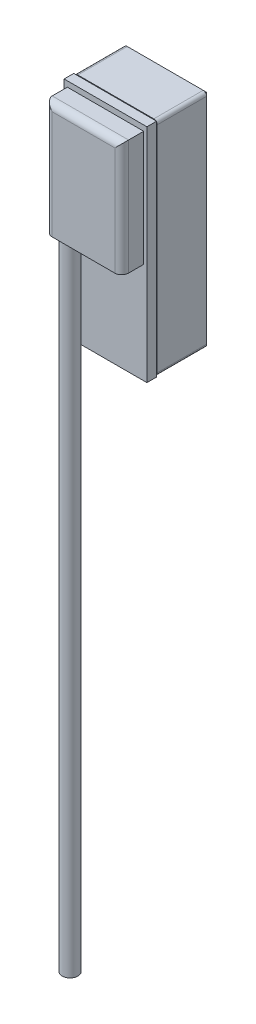
ISO-10303-21;
HEADER;
FILE_DESCRIPTION(('STEP AP214'),'2;1');
FILE_NAME('part.step','',(''),(''),'','','');
FILE_SCHEMA(('AUTOMOTIVE_DESIGN { 1 0 10303 214 1 1 1 1 }'));
ENDSEC;
DATA;
#1=APPLICATION_CONTEXT('core data for automotive mechanical design processes');
#2=APPLICATION_PROTOCOL_DEFINITION('international standard','automotive_design',2000,#1);
#3=PRODUCT_CONTEXT('',#1,'mechanical');
#4=PRODUCT('Part','Part','',(#3));
#5=PRODUCT_RELATED_PRODUCT_CATEGORY('part','',(#4));
#6=PRODUCT_DEFINITION_FORMATION('','',#4);
#7=PRODUCT_DEFINITION_CONTEXT('part definition',#1,'design');
#8=PRODUCT_DEFINITION('design','',#6,#7);
#9=PRODUCT_DEFINITION_SHAPE('','',#8);
#10=(LENGTH_UNIT() NAMED_UNIT(*) SI_UNIT(.MILLI.,.METRE.));
#11=(NAMED_UNIT(*) PLANE_ANGLE_UNIT() SI_UNIT($,.RADIAN.));
#12=(NAMED_UNIT(*) SI_UNIT($,.STERADIAN.) SOLID_ANGLE_UNIT());
#13=UNCERTAINTY_MEASURE_WITH_UNIT(LENGTH_MEASURE(1.E-05),#10,'distance_accuracy_value','');
#14=(GEOMETRIC_REPRESENTATION_CONTEXT(3) GLOBAL_UNCERTAINTY_ASSIGNED_CONTEXT((#13)) GLOBAL_UNIT_ASSIGNED_CONTEXT((#10,
#11,#12)) REPRESENTATION_CONTEXT('',''));
#15=CARTESIAN_POINT('',(0.,0.,0.));
#16=DIRECTION('',(0.,0.,1.));
#17=DIRECTION('',(1.,0.,0.));
#18=AXIS2_PLACEMENT_3D('',#15,#16,#17);
#19=CARTESIAN_POINT('',(0.,0.,4.59));
#20=DIRECTION('',(0.,0.,-1.));
#21=DIRECTION('',(-1.,0.,0.));
#22=AXIS2_PLACEMENT_3D('',#19,#20,#21);
#23=PLANE('',#22);
#24=DIRECTION('',(0.,1.,0.));
#25=VECTOR('',#24,1.);
#26=CARTESIAN_POINT('',(3.01,-8.055,4.59));
#27=LINE('',#26,#25);
#28=CARTESIAN_POINT('',(3.01,-8.055,4.59));
#29=VERTEX_POINT('',#28);
#30=CARTESIAN_POINT('',(3.01,8.055,4.59));
#31=VERTEX_POINT('',#30);
#32=EDGE_CURVE('E161',#29,#31,#27,.T.);
#33=ORIENTED_EDGE('',*,*,#32,.T.);
#34=DIRECTION('',(-1.,0.,0.));
#35=VECTOR('',#34,1.);
#36=CARTESIAN_POINT('',(-3.01,8.055,4.59));
#37=LINE('',#36,#35);
#38=CARTESIAN_POINT('',(-3.01,8.055,4.59));
#39=VERTEX_POINT('',#38);
#40=EDGE_CURVE('E164',#31,#39,#37,.T.);
#41=ORIENTED_EDGE('',*,*,#40,.T.);
#42=DIRECTION('',(0.,-1.,0.));
#43=VECTOR('',#42,1.);
#44=CARTESIAN_POINT('',(-3.01,-8.055,4.59));
#45=LINE('',#44,#43);
#46=CARTESIAN_POINT('',(-3.01,-8.055,4.59));
#47=VERTEX_POINT('',#46);
#48=EDGE_CURVE('E167',#39,#47,#45,.T.);
#49=ORIENTED_EDGE('',*,*,#48,.T.);
#50=DIRECTION('',(1.,0.,0.));
#51=VECTOR('',#50,1.);
#52=CARTESIAN_POINT('',(-3.01,-8.055,4.59));
#53=LINE('',#52,#51);
#54=EDGE_CURVE('E169',#47,#29,#53,.T.);
#55=ORIENTED_EDGE('',*,*,#54,.T.);
#56=EDGE_LOOP('',(#33,#41,#49,#55));
#57=FACE_BOUND('',#56,.T.);
#58=DIRECTION('',(0.,1.,0.));
#59=VECTOR('',#58,1.);
#60=CARTESIAN_POINT('',(2.775,-0.725000000000003,4.59));
#61=LINE('',#60,#59);
#62=CARTESIAN_POINT('',(2.775,-0.725000000000003,4.59));
#63=VERTEX_POINT('',#62);
#64=CARTESIAN_POINT('',(2.775,7.655,4.59));
#65=VERTEX_POINT('',#64);
#66=EDGE_CURVE('E128',#63,#65,#61,.T.);
#67=ORIENTED_EDGE('',*,*,#66,.F.);
#68=DIRECTION('',(1.,0.,0.));
#69=VECTOR('',#68,1.);
#70=CARTESIAN_POINT('',(-2.775,-0.725000000000003,4.59));
#71=LINE('',#70,#69);
#72=CARTESIAN_POINT('',(-2.775,-0.725000000000003,4.59));
#73=VERTEX_POINT('',#72);
#74=EDGE_CURVE('E140',#73,#63,#71,.T.);
#75=ORIENTED_EDGE('',*,*,#74,.F.);
#76=DIRECTION('',(0.,-1.,0.));
#77=VECTOR('',#76,1.);
#78=CARTESIAN_POINT('',(-2.775,-0.725000000000003,4.59));
#79=LINE('',#78,#77);
#80=CARTESIAN_POINT('',(-2.775,7.655,4.59));
#81=VERTEX_POINT('',#80);
#82=EDGE_CURVE('E148',#81,#73,#79,.T.);
#83=ORIENTED_EDGE('',*,*,#82,.F.);
#84=DIRECTION('',(-1.,0.,0.));
#85=VECTOR('',#84,1.);
#86=CARTESIAN_POINT('',(-2.775,7.655,4.59));
#87=LINE('',#86,#85);
#88=EDGE_CURVE('E143',#65,#81,#87,.T.);
#89=ORIENTED_EDGE('',*,*,#88,.F.);
#90=EDGE_LOOP('',(#67,#75,#83,#89));
#91=FACE_BOUND('',#90,.T.);
#92=ADVANCED_FACE('F47',(#57,#91),#23,.F.);
#93=CARTESIAN_POINT('',(3.01,-8.055,4.59));
#94=DIRECTION('',(-1.,0.,0.));
#95=DIRECTION('',(0.,0.,1.));
#96=AXIS2_PLACEMENT_3D('',#93,#94,#95);
#97=PLANE('',#96);
#98=DIRECTION('',(0.,1.,0.));
#99=VECTOR('',#98,1.);
#100=CARTESIAN_POINT('',(3.01,-8.055,3.89));
#101=LINE('',#100,#99);
#102=CARTESIAN_POINT('',(3.01,-8.055,3.89));
#103=VERTEX_POINT('',#102);
#104=CARTESIAN_POINT('',(3.01,8.055,3.89));
#105=VERTEX_POINT('',#104);
#106=EDGE_CURVE('E160',#103,#105,#101,.T.);
#107=ORIENTED_EDGE('',*,*,#106,.T.);
#108=DIRECTION('',(0.,0.,-1.));
#109=VECTOR('',#108,1.);
#110=CARTESIAN_POINT('',(3.01,8.055,4.59));
#111=LINE('',#110,#109);
#112=EDGE_CURVE('E187',#31,#105,#111,.T.);
#113=ORIENTED_EDGE('',*,*,#112,.F.);
#114=ORIENTED_EDGE('',*,*,#32,.F.);
#115=DIRECTION('',(0.,0.,-1.));
#116=VECTOR('',#115,1.);
#117=CARTESIAN_POINT('',(3.01,-8.055,4.59));
#118=LINE('',#117,#116);
#119=EDGE_CURVE('E171',#29,#103,#118,.T.);
#120=ORIENTED_EDGE('',*,*,#119,.T.);
#121=EDGE_LOOP('',(#107,#113,#114,#120));
#122=FACE_BOUND('',#121,.T.);
#123=ADVANCED_FACE('F235',(#122),#97,.F.);
#124=CARTESIAN_POINT('',(-3.01,8.055,4.59));
#125=DIRECTION('',(0.,-1.,0.));
#126=DIRECTION('',(0.,0.,-1.));
#127=AXIS2_PLACEMENT_3D('',#124,#125,#126);
#128=PLANE('',#127);
#129=DIRECTION('',(-1.,0.,0.));
#130=VECTOR('',#129,1.);
#131=CARTESIAN_POINT('',(-3.01,8.055,3.89));
#132=LINE('',#131,#130);
#133=CARTESIAN_POINT('',(-3.01,8.055,3.89));
#134=VERTEX_POINT('',#133);
#135=EDGE_CURVE('E174',#105,#134,#132,.T.);
#136=ORIENTED_EDGE('',*,*,#135,.T.);
#137=DIRECTION('',(0.,0.,-1.));
#138=VECTOR('',#137,1.);
#139=CARTESIAN_POINT('',(-3.01,8.055,4.59));
#140=LINE('',#139,#138);
#141=EDGE_CURVE('E184',#39,#134,#140,.T.);
#142=ORIENTED_EDGE('',*,*,#141,.F.);
#143=ORIENTED_EDGE('',*,*,#40,.F.);
#144=ORIENTED_EDGE('',*,*,#112,.T.);
#145=EDGE_LOOP('',(#136,#142,#143,#144));
#146=FACE_BOUND('',#145,.T.);
#147=ADVANCED_FACE('F241',(#146),#128,.F.);
#148=CARTESIAN_POINT('',(-3.01,-8.055,4.59));
#149=DIRECTION('',(1.,0.,0.));
#150=DIRECTION('',(0.,0.,-1.));
#151=AXIS2_PLACEMENT_3D('',#148,#149,#150);
#152=PLANE('',#151);
#153=DIRECTION('',(0.,-1.,0.));
#154=VECTOR('',#153,1.);
#155=CARTESIAN_POINT('',(-3.01,-8.055,3.89));
#156=LINE('',#155,#154);
#157=CARTESIAN_POINT('',(-3.01,-8.055,3.89));
#158=VERTEX_POINT('',#157);
#159=EDGE_CURVE('E176',#134,#158,#156,.T.);
#160=ORIENTED_EDGE('',*,*,#159,.T.);
#161=DIRECTION('',(0.,0.,-1.));
#162=VECTOR('',#161,1.);
#163=CARTESIAN_POINT('',(-3.01,-8.055,4.59));
#164=LINE('',#163,#162);
#165=EDGE_CURVE('E181',#47,#158,#164,.T.);
#166=ORIENTED_EDGE('',*,*,#165,.F.);
#167=ORIENTED_EDGE('',*,*,#48,.F.);
#168=ORIENTED_EDGE('',*,*,#141,.T.);
#169=EDGE_LOOP('',(#160,#166,#167,#168));
#170=FACE_BOUND('',#169,.T.);
#171=ADVANCED_FACE('F253',(#170),#152,.F.);
#172=CARTESIAN_POINT('',(-3.01,-8.055,4.59));
#173=DIRECTION('',(0.,1.,0.));
#174=DIRECTION('',(0.,0.,1.));
#175=AXIS2_PLACEMENT_3D('',#172,#173,#174);
#176=PLANE('',#175);
#177=DIRECTION('',(1.,0.,0.));
#178=VECTOR('',#177,1.);
#179=CARTESIAN_POINT('',(-3.01,-8.055,3.89));
#180=LINE('',#179,#178);
#181=EDGE_CURVE('E165',#158,#103,#180,.T.);
#182=ORIENTED_EDGE('',*,*,#181,.T.);
#183=ORIENTED_EDGE('',*,*,#119,.F.);
#184=ORIENTED_EDGE('',*,*,#54,.F.);
#185=ORIENTED_EDGE('',*,*,#165,.T.);
#186=EDGE_LOOP('',(#182,#183,#184,#185));
#187=FACE_BOUND('',#186,.T.);
#188=ADVANCED_FACE('F249',(#187),#176,.F.);
#189=CARTESIAN_POINT('',(0.,0.,3.89));
#190=DIRECTION('',(0.,0.,-1.));
#191=DIRECTION('',(-1.,0.,0.));
#192=AXIS2_PLACEMENT_3D('',#189,#190,#191);
#193=PLANE('',#192);
#194=ORIENTED_EDGE('',*,*,#106,.F.);
#195=ORIENTED_EDGE('',*,*,#181,.F.);
#196=ORIENTED_EDGE('',*,*,#159,.F.);
#197=ORIENTED_EDGE('',*,*,#135,.F.);
#198=EDGE_LOOP('',(#194,#195,#196,#197));
#199=FACE_BOUND('',#198,.T.);
#200=ADVANCED_FACE('F246',(#199),#193,.T.);
#201=CARTESIAN_POINT('',(2.775,-0.725000000000003,6.19));
#202=DIRECTION('',(-1.,0.,0.));
#203=DIRECTION('',(0.,0.,1.));
#204=AXIS2_PLACEMENT_3D('',#201,#202,#203);
#205=PLANE('',#204);
#206=DIRECTION('',(0.,0.,-1.));
#207=VECTOR('',#206,1.);
#208=CARTESIAN_POINT('',(2.775,7.655,6.19));
#209=LINE('',#208,#207);
#210=CARTESIAN_POINT('',(2.775,7.655,5.69));
#211=VERTEX_POINT('',#210);
#212=EDGE_CURVE('E158',#211,#65,#209,.T.);
#213=ORIENTED_EDGE('',*,*,#212,.F.);
#214=DIRECTION('',(0.,1.,0.));
#215=VECTOR('',#214,1.);
#216=CARTESIAN_POINT('',(2.775,-0.725000000000003,5.69));
#217=LINE('',#216,#215);
#218=CARTESIAN_POINT('',(2.775,-0.725000000000003,5.69));
#219=VERTEX_POINT('',#218);
#220=EDGE_CURVE('E12',#211,#219,#217,.F.);
#221=ORIENTED_EDGE('',*,*,#220,.T.);
#222=DIRECTION('',(0.,0.,-1.));
#223=VECTOR('',#222,1.);
#224=CARTESIAN_POINT('',(2.775,-0.725000000000003,6.19));
#225=LINE('',#224,#223);
#226=EDGE_CURVE('E125',#219,#63,#225,.T.);
#227=ORIENTED_EDGE('',*,*,#226,.T.);
#228=ORIENTED_EDGE('',*,*,#66,.T.);
#229=EDGE_LOOP('',(#213,#221,#227,#228));
#230=FACE_BOUND('',#229,.T.);
#231=ADVANCED_FACE('F127',(#230),#205,.F.);
#232=CARTESIAN_POINT('',(-2.775,7.655,6.19));
#233=DIRECTION('',(0.,-1.,0.));
#234=DIRECTION('',(0.,0.,-1.));
#235=AXIS2_PLACEMENT_3D('',#232,#233,#234);
#236=PLANE('',#235);
#237=DIRECTION('',(0.,0.,-1.));
#238=VECTOR('',#237,1.);
#239=CARTESIAN_POINT('',(-2.775,7.655,6.19));
#240=LINE('',#239,#238);
#241=CARTESIAN_POINT('',(-2.775,7.655,5.69));
#242=VERTEX_POINT('',#241);
#243=EDGE_CURVE('E156',#242,#81,#240,.T.);
#244=ORIENTED_EDGE('',*,*,#243,.F.);
#245=DIRECTION('',(-1.,0.,0.));
#246=VECTOR('',#245,1.);
#247=CARTESIAN_POINT('',(-2.775,7.655,5.69));
#248=LINE('',#247,#246);
#249=EDGE_CURVE('E56',#242,#211,#248,.F.);
#250=ORIENTED_EDGE('',*,*,#249,.T.);
#251=ORIENTED_EDGE('',*,*,#212,.T.);
#252=ORIENTED_EDGE('',*,*,#88,.T.);
#253=EDGE_LOOP('',(#244,#250,#251,#252));
#254=FACE_BOUND('',#253,.T.);
#255=ADVANCED_FACE('F218',(#254),#236,.F.);
#256=CARTESIAN_POINT('',(-2.775,-0.725000000000003,6.19));
#257=DIRECTION('',(1.,0.,0.));
#258=DIRECTION('',(0.,0.,-1.));
#259=AXIS2_PLACEMENT_3D('',#256,#257,#258);
#260=PLANE('',#259);
#261=DIRECTION('',(0.,0.,-1.));
#262=VECTOR('',#261,1.);
#263=CARTESIAN_POINT('',(-2.775,-0.725000000000003,6.19));
#264=LINE('',#263,#262);
#265=CARTESIAN_POINT('',(-2.775,-0.725000000000003,5.69));
#266=VERTEX_POINT('',#265);
#267=EDGE_CURVE('E133',#266,#73,#264,.T.);
#268=ORIENTED_EDGE('',*,*,#267,.F.);
#269=DIRECTION('',(0.,-1.,0.));
#270=VECTOR('',#269,1.);
#271=CARTESIAN_POINT('',(-2.775,-0.725000000000003,5.69));
#272=LINE('',#271,#270);
#273=EDGE_CURVE('E71',#266,#242,#272,.F.);
#274=ORIENTED_EDGE('',*,*,#273,.T.);
#275=ORIENTED_EDGE('',*,*,#243,.T.);
#276=ORIENTED_EDGE('',*,*,#82,.T.);
#277=EDGE_LOOP('',(#268,#274,#275,#276));
#278=FACE_BOUND('',#277,.T.);
#279=ADVANCED_FACE('F224',(#278),#260,.F.);
#280=CARTESIAN_POINT('',(-2.775,-0.725000000000003,6.19));
#281=DIRECTION('',(0.,1.,0.));
#282=DIRECTION('',(0.,0.,1.));
#283=AXIS2_PLACEMENT_3D('',#280,#281,#282);
#284=PLANE('',#283);
#285=CARTESIAN_POINT('',(-1.775,-0.725000000000003,5.39));
#286=DIRECTION('',(0.,1.,0.));
#287=DIRECTION('',(0.,0.,1.));
#288=AXIS2_PLACEMENT_3D('',#285,#286,#287);
#289=CIRCLE('',#288,0.57);
#290=CARTESIAN_POINT('',(-1.775,-0.725000000000003,5.96));
#291=VERTEX_POINT('',#290);
#292=EDGE_CURVE('E190',#291,#291,#289,.F.);
#293=ORIENTED_EDGE('',*,*,#292,.F.);
#294=EDGE_LOOP('',(#293));
#295=FACE_BOUND('',#294,.T.);
#296=DIRECTION('',(1.,0.,0.));
#297=VECTOR('',#296,1.);
#298=CARTESIAN_POINT('',(-2.775,-0.725000000000003,6.19));
#299=LINE('',#298,#297);
#300=CARTESIAN_POINT('',(-2.275,-0.725000000000003,6.19));
#301=VERTEX_POINT('',#300);
#302=CARTESIAN_POINT('',(2.275,-0.725000000000003,6.19));
#303=VERTEX_POINT('',#302);
#304=EDGE_CURVE('E134',#301,#303,#299,.T.);
#305=ORIENTED_EDGE('',*,*,#304,.F.);
#306=CARTESIAN_POINT('',(-2.275,-0.725000000000003,5.69));
#307=DIRECTION('',(0.,1.,0.));
#308=DIRECTION('',(0.,0.,1.));
#309=AXIS2_PLACEMENT_3D('',#306,#307,#308);
#310=CIRCLE('',#309,0.5);
#311=EDGE_CURVE('E202',#301,#266,#310,.F.);
#312=ORIENTED_EDGE('',*,*,#311,.T.);
#313=ORIENTED_EDGE('',*,*,#267,.T.);
#314=ORIENTED_EDGE('',*,*,#74,.T.);
#315=ORIENTED_EDGE('',*,*,#226,.F.);
#316=CARTESIAN_POINT('',(2.275,-0.725000000000003,5.69));
#317=DIRECTION('',(0.,1.,0.));
#318=DIRECTION('',(0.,0.,1.));
#319=AXIS2_PLACEMENT_3D('',#316,#317,#318);
#320=CIRCLE('',#319,0.5);
#321=EDGE_CURVE('E200',#219,#303,#320,.F.);
#322=ORIENTED_EDGE('',*,*,#321,.T.);
#323=EDGE_LOOP('',(#305,#312,#313,#314,#315,#322));
#324=FACE_BOUND('',#323,.T.);
#325=ADVANCED_FACE('F147',(#295,#324),#284,.F.);
#326=CARTESIAN_POINT('',(0.,0.,6.19));
#327=DIRECTION('',(0.,0.,-1.));
#328=DIRECTION('',(-1.,0.,0.));
#329=AXIS2_PLACEMENT_3D('',#326,#327,#328);
#330=PLANE('',#329);
#331=DIRECTION('',(-1.,0.,0.));
#332=VECTOR('',#331,1.);
#333=CARTESIAN_POINT('',(0.,7.155,6.19));
#334=LINE('',#333,#332);
#335=CARTESIAN_POINT('',(2.275,7.155,6.19));
#336=VERTEX_POINT('',#335);
#337=CARTESIAN_POINT('',(-2.275,7.155,6.19));
#338=VERTEX_POINT('',#337);
#339=EDGE_CURVE('E195',#336,#338,#334,.T.);
#340=ORIENTED_EDGE('',*,*,#339,.T.);
#341=DIRECTION('',(0.,-1.,0.));
#342=VECTOR('',#341,1.);
#343=CARTESIAN_POINT('',(-2.275,0.,6.19));
#344=LINE('',#343,#342);
#345=EDGE_CURVE('E197',#338,#301,#344,.T.);
#346=ORIENTED_EDGE('',*,*,#345,.T.);
#347=ORIENTED_EDGE('',*,*,#304,.T.);
#348=DIRECTION('',(0.,1.,0.));
#349=VECTOR('',#348,1.);
#350=CARTESIAN_POINT('',(2.275,0.,6.19));
#351=LINE('',#350,#349);
#352=EDGE_CURVE('E193',#303,#336,#351,.T.);
#353=ORIENTED_EDGE('',*,*,#352,.T.);
#354=EDGE_LOOP('',(#340,#346,#347,#353));
#355=FACE_BOUND('',#354,.T.);
#356=ADVANCED_FACE('F222',(#355),#330,.F.);
#357=CARTESIAN_POINT('',(-1.775,-47.125,5.39));
#358=DIRECTION('',(0.,1.,0.));
#359=DIRECTION('',(0.,0.,1.));
#360=AXIS2_PLACEMENT_3D('',#357,#358,#359);
#361=CYLINDRICAL_SURFACE('',#360,0.57);
#362=CARTESIAN_POINT('',(-1.775,-47.125,5.39));
#363=DIRECTION('',(0.,-1.,0.));
#364=DIRECTION('',(0.,0.,-1.));
#365=AXIS2_PLACEMENT_3D('',#362,#363,#364);
#366=CIRCLE('',#365,0.57);
#367=CARTESIAN_POINT('',(-1.775,-47.125,4.82));
#368=VERTEX_POINT('',#367);
#369=EDGE_CURVE('E144',#368,#368,#366,.T.);
#370=ORIENTED_EDGE('',*,*,#369,.F.);
#371=EDGE_LOOP('',(#370));
#372=FACE_BOUND('',#371,.T.);
#373=ORIENTED_EDGE('',*,*,#292,.T.);
#374=EDGE_LOOP('',(#373));
#375=FACE_BOUND('',#374,.T.);
#376=ADVANCED_FACE('F271',(#372,#375),#361,.T.);
#377=CARTESIAN_POINT('',(-1.775,-47.125,5.39));
#378=DIRECTION('',(0.,-1.,0.));
#379=DIRECTION('',(0.,0.,-1.));
#380=AXIS2_PLACEMENT_3D('',#377,#378,#379);
#381=PLANE('',#380);
#382=ORIENTED_EDGE('',*,*,#369,.T.);
#383=EDGE_LOOP('',(#382));
#384=FACE_BOUND('',#383,.T.);
#385=ADVANCED_FACE('F267',(#384),#381,.T.);
#386=CARTESIAN_POINT('',(2.275,0.,5.69));
#387=DIRECTION('',(0.,1.,0.));
#388=DIRECTION('',(0.,0.,1.));
#389=AXIS2_PLACEMENT_3D('',#386,#387,#388);
#390=CYLINDRICAL_SURFACE('',#389,0.5);
#391=ORIENTED_EDGE('',*,*,#321,.F.);
#392=ORIENTED_EDGE('',*,*,#220,.F.);
#393=CARTESIAN_POINT('',(2.275,7.155,5.69));
#394=DIRECTION('',(-0.707106781186547,0.707106781186547,0.));
#395=DIRECTION('',(0.707106781186547,0.707106781186547,0.));
#396=AXIS2_PLACEMENT_3D('',#393,#394,#395);
#397=ELLIPSE('',#396,0.707106781186547,0.5);
#398=EDGE_CURVE('E51',#336,#211,#397,.T.);
#399=ORIENTED_EDGE('',*,*,#398,.F.);
#400=ORIENTED_EDGE('',*,*,#352,.F.);
#401=EDGE_LOOP('',(#391,#392,#399,#400));
#402=FACE_BOUND('',#401,.T.);
#403=ADVANCED_FACE('F49',(#402),#390,.T.);
#404=CARTESIAN_POINT('',(0.,7.155,5.69));
#405=DIRECTION('',(-1.,0.,0.));
#406=DIRECTION('',(0.,0.,1.));
#407=AXIS2_PLACEMENT_3D('',#404,#405,#406);
#408=CYLINDRICAL_SURFACE('',#407,0.5);
#409=ORIENTED_EDGE('',*,*,#398,.T.);
#410=ORIENTED_EDGE('',*,*,#249,.F.);
#411=CARTESIAN_POINT('',(-2.275,7.155,5.69));
#412=DIRECTION('',(-0.707106781186547,-0.707106781186547,0.));
#413=DIRECTION('',(-0.707106781186547,0.707106781186547,0.));
#414=AXIS2_PLACEMENT_3D('',#411,#412,#413);
#415=ELLIPSE('',#414,0.707106781186547,0.5);
#416=EDGE_CURVE('E205',#338,#242,#415,.T.);
#417=ORIENTED_EDGE('',*,*,#416,.F.);
#418=ORIENTED_EDGE('',*,*,#339,.F.);
#419=EDGE_LOOP('',(#409,#410,#417,#418));
#420=FACE_BOUND('',#419,.T.);
#421=ADVANCED_FACE('F262',(#420),#408,.T.);
#422=CARTESIAN_POINT('',(-2.275,0.,5.69));
#423=DIRECTION('',(0.,-1.,0.));
#424=DIRECTION('',(0.,0.,-1.));
#425=AXIS2_PLACEMENT_3D('',#422,#423,#424);
#426=CYLINDRICAL_SURFACE('',#425,0.5);
#427=ORIENTED_EDGE('',*,*,#416,.T.);
#428=ORIENTED_EDGE('',*,*,#273,.F.);
#429=ORIENTED_EDGE('',*,*,#311,.F.);
#430=ORIENTED_EDGE('',*,*,#345,.F.);
#431=EDGE_LOOP('',(#427,#428,#429,#430));
#432=FACE_BOUND('',#431,.T.);
#433=ADVANCED_FACE('F223',(#432),#426,.T.);
#434=CLOSED_SHELL('',(#92,#123,#147,#171,#188,#200,#231,#255,#279,#325,#356,#376,#385,#403,#421,#433));
#435=MANIFOLD_SOLID_BREP('B2',#434);
#436=CARTESIAN_POINT('',(3.01,-8.055,3.84));
#437=DIRECTION('',(-1.,0.,0.));
#438=DIRECTION('',(0.,0.,1.));
#439=AXIS2_PLACEMENT_3D('',#436,#437,#438);
#440=PLANE('',#439);
#441=DIRECTION('',(0.,0.,-1.));
#442=VECTOR('',#441,1.);
#443=CARTESIAN_POINT('',(3.01,-7.805,3.84));
#444=LINE('',#443,#442);
#445=CARTESIAN_POINT('',(3.01,-7.805,3.84));
#446=VERTEX_POINT('',#445);
#447=CARTESIAN_POINT('',(3.01,-7.805,0.25));
#448=VERTEX_POINT('',#447);
#449=EDGE_CURVE('E511',#446,#448,#444,.T.);
#450=ORIENTED_EDGE('',*,*,#449,.T.);
#451=DIRECTION('',(0.,1.,0.));
#452=VECTOR('',#451,1.);
#453=CARTESIAN_POINT('',(3.01,7.805,0.25));
#454=LINE('',#453,#452);
#455=CARTESIAN_POINT('',(3.01,7.805,0.25));
#456=VERTEX_POINT('',#455);
#457=EDGE_CURVE('E519',#448,#456,#454,.T.);
#458=ORIENTED_EDGE('',*,*,#457,.T.);
#459=DIRECTION('',(0.,0.,-1.));
#460=VECTOR('',#459,1.);
#461=CARTESIAN_POINT('',(3.01,7.805,3.84));
#462=LINE('',#461,#460);
#463=CARTESIAN_POINT('',(3.01,7.805,3.84));
#464=VERTEX_POINT('',#463);
#465=EDGE_CURVE('E485',#456,#464,#462,.F.);
#466=ORIENTED_EDGE('',*,*,#465,.T.);
#467=DIRECTION('',(0.,1.,0.));
#468=VECTOR('',#467,1.);
#469=CARTESIAN_POINT('',(3.01,-8.055,3.84));
#470=LINE('',#469,#468);
#471=EDGE_CURVE('E571',#446,#464,#470,.T.);
#472=ORIENTED_EDGE('',*,*,#471,.F.);
#473=EDGE_LOOP('',(#450,#458,#466,#472));
#474=FACE_BOUND('',#473,.T.);
#475=ADVANCED_FACE('F396',(#474),#440,.F.);
#476=CARTESIAN_POINT('',(-3.01,8.055,3.84));
#477=DIRECTION('',(0.,-1.,0.));
#478=DIRECTION('',(0.,0.,-1.));
#479=AXIS2_PLACEMENT_3D('',#476,#477,#478);
#480=PLANE('',#479);
#481=DIRECTION('',(0.,0.,-1.));
#482=VECTOR('',#481,1.);
#483=CARTESIAN_POINT('',(2.76,8.055,3.84));
#484=LINE('',#483,#482);
#485=CARTESIAN_POINT('',(2.76,8.055,3.84));
#486=VERTEX_POINT('',#485);
#487=CARTESIAN_POINT('',(2.76,8.055,0.25));
#488=VERTEX_POINT('',#487);
#489=EDGE_CURVE('E516',#486,#488,#484,.T.);
#490=ORIENTED_EDGE('',*,*,#489,.T.);
#491=DIRECTION('',(-1.,0.,0.));
#492=VECTOR('',#491,1.);
#493=CARTESIAN_POINT('',(-2.76,8.055,0.25));
#494=LINE('',#493,#492);
#495=CARTESIAN_POINT('',(-2.76,8.055,0.25));
#496=VERTEX_POINT('',#495);
#497=EDGE_CURVE('E535',#488,#496,#494,.T.);
#498=ORIENTED_EDGE('',*,*,#497,.T.);
#499=DIRECTION('',(0.,0.,-1.));
#500=VECTOR('',#499,1.);
#501=CARTESIAN_POINT('',(-2.76,8.055,3.84));
#502=LINE('',#501,#500);
#503=CARTESIAN_POINT('',(-2.76,8.055,3.84));
#504=VERTEX_POINT('',#503);
#505=EDGE_CURVE('E514',#496,#504,#502,.F.);
#506=ORIENTED_EDGE('',*,*,#505,.T.);
#507=DIRECTION('',(-1.,0.,0.));
#508=VECTOR('',#507,1.);
#509=CARTESIAN_POINT('',(-3.01,8.055,3.84));
#510=LINE('',#509,#508);
#511=EDGE_CURVE('E576',#486,#504,#510,.T.);
#512=ORIENTED_EDGE('',*,*,#511,.F.);
#513=EDGE_LOOP('',(#490,#498,#506,#512));
#514=FACE_BOUND('',#513,.T.);
#515=ADVANCED_FACE('F607',(#514),#480,.F.);
#516=CARTESIAN_POINT('',(-3.01,-8.055,3.84));
#517=DIRECTION('',(1.,0.,0.));
#518=DIRECTION('',(0.,0.,-1.));
#519=AXIS2_PLACEMENT_3D('',#516,#517,#518);
#520=PLANE('',#519);
#521=DIRECTION('',(0.,0.,-1.));
#522=VECTOR('',#521,1.);
#523=CARTESIAN_POINT('',(-3.01,7.805,3.84));
#524=LINE('',#523,#522);
#525=CARTESIAN_POINT('',(-3.01,7.805,3.84));
#526=VERTEX_POINT('',#525);
#527=CARTESIAN_POINT('',(-3.01,7.805,0.25));
#528=VERTEX_POINT('',#527);
#529=EDGE_CURVE('E498',#526,#528,#524,.T.);
#530=ORIENTED_EDGE('',*,*,#529,.T.);
#531=DIRECTION('',(0.,-1.,0.));
#532=VECTOR('',#531,1.);
#533=CARTESIAN_POINT('',(-3.01,-7.805,0.25));
#534=LINE('',#533,#532);
#535=CARTESIAN_POINT('',(-3.01,-7.805,0.25));
#536=VERTEX_POINT('',#535);
#537=EDGE_CURVE('E45',#528,#536,#534,.T.);
#538=ORIENTED_EDGE('',*,*,#537,.T.);
#539=DIRECTION('',(0.,0.,-1.));
#540=VECTOR('',#539,1.);
#541=CARTESIAN_POINT('',(-3.01,-7.805,3.84));
#542=LINE('',#541,#540);
#543=CARTESIAN_POINT('',(-3.01,-7.805,3.84));
#544=VERTEX_POINT('',#543);
#545=EDGE_CURVE('E500',#536,#544,#542,.F.);
#546=ORIENTED_EDGE('',*,*,#545,.T.);
#547=DIRECTION('',(0.,-1.,0.));
#548=VECTOR('',#547,1.);
#549=CARTESIAN_POINT('',(-3.01,-8.055,3.84));
#550=LINE('',#549,#548);
#551=EDGE_CURVE('E482',#526,#544,#550,.T.);
#552=ORIENTED_EDGE('',*,*,#551,.F.);
#553=EDGE_LOOP('',(#530,#538,#546,#552));
#554=FACE_BOUND('',#553,.T.);
#555=ADVANCED_FACE('F585',(#554),#520,.F.);
#556=CARTESIAN_POINT('',(-3.01,-8.055,3.84));
#557=DIRECTION('',(0.,1.,0.));
#558=DIRECTION('',(0.,0.,1.));
#559=AXIS2_PLACEMENT_3D('',#556,#557,#558);
#560=PLANE('',#559);
#561=DIRECTION('',(0.,0.,-1.));
#562=VECTOR('',#561,1.);
#563=CARTESIAN_POINT('',(-2.76,-8.055,3.84));
#564=LINE('',#563,#562);
#565=CARTESIAN_POINT('',(-2.76,-8.055,3.84));
#566=VERTEX_POINT('',#565);
#567=CARTESIAN_POINT('',(-2.76,-8.055,0.25));
#568=VERTEX_POINT('',#567);
#569=EDGE_CURVE('E491',#566,#568,#564,.T.);
#570=ORIENTED_EDGE('',*,*,#569,.T.);
#571=DIRECTION('',(1.,0.,0.));
#572=VECTOR('',#571,1.);
#573=CARTESIAN_POINT('',(2.76,-8.055,0.25));
#574=LINE('',#573,#572);
#575=CARTESIAN_POINT('',(2.76,-8.055,0.25));
#576=VERTEX_POINT('',#575);
#577=EDGE_CURVE('E537',#568,#576,#574,.T.);
#578=ORIENTED_EDGE('',*,*,#577,.T.);
#579=DIRECTION('',(0.,0.,-1.));
#580=VECTOR('',#579,1.);
#581=CARTESIAN_POINT('',(2.76,-8.055,3.84));
#582=LINE('',#581,#580);
#583=CARTESIAN_POINT('',(2.76,-8.055,3.84));
#584=VERTEX_POINT('',#583);
#585=EDGE_CURVE('E494',#576,#584,#582,.F.);
#586=ORIENTED_EDGE('',*,*,#585,.T.);
#587=DIRECTION('',(1.,0.,0.));
#588=VECTOR('',#587,1.);
#589=CARTESIAN_POINT('',(-3.01,-8.055,3.84));
#590=LINE('',#589,#588);
#591=EDGE_CURVE('E479',#566,#584,#590,.T.);
#592=ORIENTED_EDGE('',*,*,#591,.F.);
#593=EDGE_LOOP('',(#570,#578,#586,#592));
#594=FACE_BOUND('',#593,.T.);
#595=ADVANCED_FACE('F490',(#594),#560,.F.);
#596=CARTESIAN_POINT('',(0.,0.,3.84));
#597=DIRECTION('',(0.,0.,-1.));
#598=DIRECTION('',(-1.,0.,0.));
#599=AXIS2_PLACEMENT_3D('',#596,#597,#598);
#600=PLANE('',#599);
#601=ORIENTED_EDGE('',*,*,#551,.T.);
#602=CARTESIAN_POINT('',(-2.76,-7.805,3.84));
#603=DIRECTION('',(0.,0.,-1.));
#604=DIRECTION('',(-1.,0.,0.));
#605=AXIS2_PLACEMENT_3D('',#602,#603,#604);
#606=CIRCLE('',#605,0.25);
#607=EDGE_CURVE('E476',#544,#566,#606,.F.);
#608=ORIENTED_EDGE('',*,*,#607,.T.);
#609=ORIENTED_EDGE('',*,*,#591,.T.);
#610=CARTESIAN_POINT('',(2.76,-7.805,3.84));
#611=DIRECTION('',(0.,0.,-1.));
#612=DIRECTION('',(-1.,0.,0.));
#613=AXIS2_PLACEMENT_3D('',#610,#611,#612);
#614=CIRCLE('',#613,0.25);
#615=EDGE_CURVE('E486',#584,#446,#614,.F.);
#616=ORIENTED_EDGE('',*,*,#615,.T.);
#617=ORIENTED_EDGE('',*,*,#471,.T.);
#618=CARTESIAN_POINT('',(2.76,7.805,3.84));
#619=DIRECTION('',(0.,0.,-1.));
#620=DIRECTION('',(-1.,0.,0.));
#621=AXIS2_PLACEMENT_3D('',#618,#619,#620);
#622=CIRCLE('',#621,0.25);
#623=EDGE_CURVE('E507',#464,#486,#622,.F.);
#624=ORIENTED_EDGE('',*,*,#623,.T.);
#625=ORIENTED_EDGE('',*,*,#511,.T.);
#626=CARTESIAN_POINT('',(-2.76,7.805,3.84));
#627=DIRECTION('',(0.,0.,-1.));
#628=DIRECTION('',(-1.,0.,0.));
#629=AXIS2_PLACEMENT_3D('',#626,#627,#628);
#630=CIRCLE('',#629,0.25);
#631=EDGE_CURVE('E505',#504,#526,#630,.F.);
#632=ORIENTED_EDGE('',*,*,#631,.T.);
#633=EDGE_LOOP('',(#601,#608,#609,#616,#617,#624,#625,#632));
#634=FACE_BOUND('',#633,.T.);
#635=ADVANCED_FACE('F478',(#634),#600,.F.);
#636=CARTESIAN_POINT('',(0.,0.,0.));
#637=DIRECTION('',(0.,0.,-1.));
#638=DIRECTION('',(-1.,0.,0.));
#639=AXIS2_PLACEMENT_3D('',#636,#637,#638);
#640=PLANE('',#639);
#641=DIRECTION('',(1.,0.,0.));
#642=VECTOR('',#641,1.);
#643=CARTESIAN_POINT('',(2.76,7.805,0.));
#644=LINE('',#643,#642);
#645=CARTESIAN_POINT('',(-2.76,7.805,0.));
#646=VERTEX_POINT('',#645);
#647=CARTESIAN_POINT('',(2.76,7.805,0.));
#648=VERTEX_POINT('',#647);
#649=EDGE_CURVE('E526',#646,#648,#644,.T.);
#650=ORIENTED_EDGE('',*,*,#649,.T.);
#651=DIRECTION('',(0.,-1.,0.));
#652=VECTOR('',#651,1.);
#653=CARTESIAN_POINT('',(2.76,-7.805,0.));
#654=LINE('',#653,#652);
#655=CARTESIAN_POINT('',(2.76,-7.805,0.));
#656=VERTEX_POINT('',#655);
#657=EDGE_CURVE('E528',#648,#656,#654,.T.);
#658=ORIENTED_EDGE('',*,*,#657,.T.);
#659=DIRECTION('',(-1.,0.,0.));
#660=VECTOR('',#659,1.);
#661=CARTESIAN_POINT('',(-2.76,-7.805,0.));
#662=LINE('',#661,#660);
#663=CARTESIAN_POINT('',(-2.76,-7.805,0.));
#664=VERTEX_POINT('',#663);
#665=EDGE_CURVE('E524',#656,#664,#662,.T.);
#666=ORIENTED_EDGE('',*,*,#665,.T.);
#667=DIRECTION('',(0.,1.,0.));
#668=VECTOR('',#667,1.);
#669=CARTESIAN_POINT('',(-2.76,7.805,0.));
#670=LINE('',#669,#668);
#671=EDGE_CURVE('E522',#664,#646,#670,.T.);
#672=ORIENTED_EDGE('',*,*,#671,.T.);
#673=EDGE_LOOP('',(#650,#658,#666,#672));
#674=FACE_BOUND('',#673,.T.);
#675=CARTESIAN_POINT('',(0.87,0.794999999999999,0.));
#676=DIRECTION('',(0.,0.,-1.));
#677=DIRECTION('',(-1.,0.,0.));
#678=AXIS2_PLACEMENT_3D('',#675,#676,#677);
#679=CIRCLE('',#678,0.725);
#680=CARTESIAN_POINT('',(0.145,0.794999999999999,0.));
#681=VERTEX_POINT('',#680);
#682=EDGE_CURVE('E562',#681,#681,#679,.T.);
#683=ORIENTED_EDGE('',*,*,#682,.F.);
#684=EDGE_LOOP('',(#683));
#685=FACE_BOUND('',#684,.T.);
#686=ADVANCED_FACE('F619',(#674,#685),#640,.T.);
#687=CARTESIAN_POINT('',(0.87,0.794999999999999,-0.2));
#688=DIRECTION('',(0.,0.,1.));
#689=DIRECTION('',(1.,0.,0.));
#690=AXIS2_PLACEMENT_3D('',#687,#688,#689);
#691=CYLINDRICAL_SURFACE('',#690,0.725);
#692=CARTESIAN_POINT('',(0.87,0.794999999999999,-0.2));
#693=DIRECTION('',(0.,0.,-1.));
#694=DIRECTION('',(-1.,0.,0.));
#695=AXIS2_PLACEMENT_3D('',#692,#693,#694);
#696=CIRCLE('',#695,0.725);
#697=CARTESIAN_POINT('',(0.145,0.794999999999999,-0.2));
#698=VERTEX_POINT('',#697);
#699=EDGE_CURVE('E566',#698,#698,#696,.T.);
#700=ORIENTED_EDGE('',*,*,#699,.F.);
#701=EDGE_LOOP('',(#700));
#702=FACE_BOUND('',#701,.T.);
#703=ORIENTED_EDGE('',*,*,#682,.T.);
#704=EDGE_LOOP('',(#703));
#705=FACE_BOUND('',#704,.T.);
#706=ADVANCED_FACE('F622',(#702,#705),#691,.T.);
#707=CARTESIAN_POINT('',(0.87,0.794999999999999,-0.2));
#708=DIRECTION('',(0.,0.,-1.));
#709=DIRECTION('',(-1.,0.,0.));
#710=AXIS2_PLACEMENT_3D('',#707,#708,#709);
#711=PLANE('',#710);
#712=ORIENTED_EDGE('',*,*,#699,.T.);
#713=EDGE_LOOP('',(#712));
#714=FACE_BOUND('',#713,.T.);
#715=ADVANCED_FACE('F628',(#714),#711,.T.);
#716=CARTESIAN_POINT('',(-2.76,-7.805,3.84));
#717=DIRECTION('',(0.,0.,-1.));
#718=DIRECTION('',(-1.,0.,0.));
#719=AXIS2_PLACEMENT_3D('',#716,#717,#718);
#720=CYLINDRICAL_SURFACE('',#719,0.25);
#721=ORIENTED_EDGE('',*,*,#545,.F.);
#722=CARTESIAN_POINT('',(-2.76,-7.805,0.25));
#723=DIRECTION('',(0.,0.,-1.));
#724=DIRECTION('',(-1.,0.,0.));
#725=AXIS2_PLACEMENT_3D('',#722,#723,#724);
#726=CIRCLE('',#725,0.25);
#727=EDGE_CURVE('E405',#536,#568,#726,.F.);
#728=ORIENTED_EDGE('',*,*,#727,.T.);
#729=ORIENTED_EDGE('',*,*,#569,.F.);
#730=ORIENTED_EDGE('',*,*,#607,.F.);
#731=EDGE_LOOP('',(#721,#728,#729,#730));
#732=FACE_BOUND('',#731,.T.);
#733=ADVANCED_FACE('F496',(#732),#720,.T.);
#734=CARTESIAN_POINT('',(2.76,-7.805,3.84));
#735=DIRECTION('',(0.,0.,-1.));
#736=DIRECTION('',(-1.,0.,0.));
#737=AXIS2_PLACEMENT_3D('',#734,#735,#736);
#738=CYLINDRICAL_SURFACE('',#737,0.25);
#739=ORIENTED_EDGE('',*,*,#585,.F.);
#740=CARTESIAN_POINT('',(2.76,-7.805,0.25));
#741=DIRECTION('',(0.,0.,-1.));
#742=DIRECTION('',(-1.,0.,0.));
#743=AXIS2_PLACEMENT_3D('',#740,#741,#742);
#744=CIRCLE('',#743,0.25);
#745=EDGE_CURVE('E533',#576,#448,#744,.F.);
#746=ORIENTED_EDGE('',*,*,#745,.T.);
#747=ORIENTED_EDGE('',*,*,#449,.F.);
#748=ORIENTED_EDGE('',*,*,#615,.F.);
#749=EDGE_LOOP('',(#739,#746,#747,#748));
#750=FACE_BOUND('',#749,.T.);
#751=ADVANCED_FACE('F596',(#750),#738,.T.);
#752=CARTESIAN_POINT('',(2.76,7.805,3.84));
#753=DIRECTION('',(0.,0.,-1.));
#754=DIRECTION('',(-1.,0.,0.));
#755=AXIS2_PLACEMENT_3D('',#752,#753,#754);
#756=CYLINDRICAL_SURFACE('',#755,0.25);
#757=ORIENTED_EDGE('',*,*,#465,.F.);
#758=CARTESIAN_POINT('',(2.76,7.805,0.25));
#759=DIRECTION('',(0.,0.,-1.));
#760=DIRECTION('',(-1.,0.,0.));
#761=AXIS2_PLACEMENT_3D('',#758,#759,#760);
#762=CIRCLE('',#761,0.25);
#763=EDGE_CURVE('E531',#456,#488,#762,.F.);
#764=ORIENTED_EDGE('',*,*,#763,.T.);
#765=ORIENTED_EDGE('',*,*,#489,.F.);
#766=ORIENTED_EDGE('',*,*,#623,.F.);
#767=EDGE_LOOP('',(#757,#764,#765,#766));
#768=FACE_BOUND('',#767,.T.);
#769=ADVANCED_FACE('F604',(#768),#756,.T.);
#770=CARTESIAN_POINT('',(-2.76,7.805,3.84));
#771=DIRECTION('',(0.,0.,-1.));
#772=DIRECTION('',(-1.,0.,0.));
#773=AXIS2_PLACEMENT_3D('',#770,#771,#772);
#774=CYLINDRICAL_SURFACE('',#773,0.25);
#775=ORIENTED_EDGE('',*,*,#505,.F.);
#776=CARTESIAN_POINT('',(-2.76,7.805,0.25));
#777=DIRECTION('',(0.,0.,-1.));
#778=DIRECTION('',(-1.,0.,0.));
#779=AXIS2_PLACEMENT_3D('',#776,#777,#778);
#780=CIRCLE('',#779,0.25);
#781=EDGE_CURVE('E419',#496,#528,#780,.F.);
#782=ORIENTED_EDGE('',*,*,#781,.T.);
#783=ORIENTED_EDGE('',*,*,#529,.F.);
#784=ORIENTED_EDGE('',*,*,#631,.F.);
#785=EDGE_LOOP('',(#775,#782,#783,#784));
#786=FACE_BOUND('',#785,.T.);
#787=ADVANCED_FACE('F584',(#786),#774,.T.);
#788=CARTESIAN_POINT('',(-3.01,-8.055,0.25));
#789=DIRECTION('',(-0.707106781186545,0.,-0.70710678118655));
#790=DIRECTION('',(0.,1.,0.));
#791=AXIS2_PLACEMENT_3D('',#788,#789,#790);
#792=PLANE('',#791);
#793=DIRECTION('',(0.70710678118655,0.,-0.707106781186545));
#794=VECTOR('',#793,1.);
#795=CARTESIAN_POINT('',(-3.01,-7.805,0.25));
#796=LINE('',#795,#794);
#797=EDGE_CURVE('E400',#536,#664,#796,.T.);
#798=ORIENTED_EDGE('',*,*,#797,.F.);
#799=ORIENTED_EDGE('',*,*,#537,.F.);
#800=DIRECTION('',(-0.70710678118655,0.,0.707106781186545));
#801=VECTOR('',#800,1.);
#802=CARTESIAN_POINT('',(-2.76,7.805,0.));
#803=LINE('',#802,#801);
#804=EDGE_CURVE('E556',#646,#528,#803,.T.);
#805=ORIENTED_EDGE('',*,*,#804,.F.);
#806=ORIENTED_EDGE('',*,*,#671,.F.);
#807=EDGE_LOOP('',(#798,#799,#805,#806));
#808=FACE_BOUND('',#807,.T.);
#809=ADVANCED_FACE('F398',(#808),#792,.T.);
#810=CARTESIAN_POINT('',(-2.76,-7.805,0.25));
#811=DIRECTION('',(0.,0.,1.));
#812=DIRECTION('',(1.,0.,0.));
#813=AXIS2_PLACEMENT_3D('',#810,#811,#812);
#814=CONICAL_SURFACE('',#813,0.250000000000002,0.785398163397452);
#815=ORIENTED_EDGE('',*,*,#727,.F.);
#816=ORIENTED_EDGE('',*,*,#797,.T.);
#817=DIRECTION('',(0.,0.70710678118655,-0.707106781186545));
#818=VECTOR('',#817,1.);
#819=CARTESIAN_POINT('',(-2.76,-8.055,0.25));
#820=LINE('',#819,#818);
#821=EDGE_CURVE('E554',#568,#664,#820,.T.);
#822=ORIENTED_EDGE('',*,*,#821,.F.);
#823=EDGE_LOOP('',(#815,#816,#822));
#824=FACE_BOUND('',#823,.T.);
#825=ADVANCED_FACE('F588',(#824),#814,.T.);
#826=CARTESIAN_POINT('',(-2.76,7.805,0.25));
#827=DIRECTION('',(0.,0.,1.));
#828=DIRECTION('',(1.,0.,0.));
#829=AXIS2_PLACEMENT_3D('',#826,#827,#828);
#830=CONICAL_SURFACE('',#829,0.250000000000002,0.785398163397452);
#831=ORIENTED_EDGE('',*,*,#804,.T.);
#832=ORIENTED_EDGE('',*,*,#781,.F.);
#833=DIRECTION('',(0.,0.70710678118655,0.707106781186545));
#834=VECTOR('',#833,1.);
#835=CARTESIAN_POINT('',(-2.76,7.805,0.));
#836=LINE('',#835,#834);
#837=EDGE_CURVE('E551',#646,#496,#836,.T.);
#838=ORIENTED_EDGE('',*,*,#837,.F.);
#839=EDGE_LOOP('',(#831,#832,#838));
#840=FACE_BOUND('',#839,.T.);
#841=ADVANCED_FACE('F661',(#840),#830,.T.);
#842=CARTESIAN_POINT('',(-3.01,-8.055,0.25));
#843=DIRECTION('',(0.,-0.707106781186545,-0.70710678118655));
#844=DIRECTION('',(-1.,0.,0.));
#845=AXIS2_PLACEMENT_3D('',#842,#843,#844);
#846=PLANE('',#845);
#847=ORIENTED_EDGE('',*,*,#821,.T.);
#848=ORIENTED_EDGE('',*,*,#665,.F.);
#849=DIRECTION('',(0.,0.70710678118655,-0.707106781186545));
#850=VECTOR('',#849,1.);
#851=CARTESIAN_POINT('',(2.76,-8.055,0.25));
#852=LINE('',#851,#850);
#853=EDGE_CURVE('E548',#576,#656,#852,.T.);
#854=ORIENTED_EDGE('',*,*,#853,.F.);
#855=ORIENTED_EDGE('',*,*,#577,.F.);
#856=EDGE_LOOP('',(#847,#848,#854,#855));
#857=FACE_BOUND('',#856,.T.);
#858=ADVANCED_FACE('F593',(#857),#846,.T.);
#859=CARTESIAN_POINT('',(-3.01,8.055,0.25));
#860=DIRECTION('',(0.,0.707106781186545,-0.70710678118655));
#861=DIRECTION('',(1.,0.,0.));
#862=AXIS2_PLACEMENT_3D('',#859,#860,#861);
#863=PLANE('',#862);
#864=ORIENTED_EDGE('',*,*,#837,.T.);
#865=ORIENTED_EDGE('',*,*,#497,.F.);
#866=DIRECTION('',(0.,0.70710678118655,0.707106781186545));
#867=VECTOR('',#866,1.);
#868=CARTESIAN_POINT('',(2.76,7.805,0.));
#869=LINE('',#868,#867);
#870=EDGE_CURVE('E545',#648,#488,#869,.T.);
#871=ORIENTED_EDGE('',*,*,#870,.F.);
#872=ORIENTED_EDGE('',*,*,#649,.F.);
#873=EDGE_LOOP('',(#864,#865,#871,#872));
#874=FACE_BOUND('',#873,.T.);
#875=ADVANCED_FACE('F610',(#874),#863,.T.);
#876=CARTESIAN_POINT('',(2.76,-7.805,0.25));
#877=DIRECTION('',(0.,0.,1.));
#878=DIRECTION('',(1.,0.,0.));
#879=AXIS2_PLACEMENT_3D('',#876,#877,#878);
#880=CONICAL_SURFACE('',#879,0.250000000000002,0.785398163397452);
#881=ORIENTED_EDGE('',*,*,#745,.F.);
#882=ORIENTED_EDGE('',*,*,#853,.T.);
#883=DIRECTION('',(-0.70710678118655,0.,-0.707106781186545));
#884=VECTOR('',#883,1.);
#885=CARTESIAN_POINT('',(3.01,-7.805,0.25));
#886=LINE('',#885,#884);
#887=EDGE_CURVE('E543',#448,#656,#886,.T.);
#888=ORIENTED_EDGE('',*,*,#887,.F.);
#889=EDGE_LOOP('',(#881,#882,#888));
#890=FACE_BOUND('',#889,.T.);
#891=ADVANCED_FACE('F653',(#890),#880,.T.);
#892=CARTESIAN_POINT('',(2.76,7.805,0.25));
#893=DIRECTION('',(0.,0.,1.));
#894=DIRECTION('',(1.,0.,0.));
#895=AXIS2_PLACEMENT_3D('',#892,#893,#894);
#896=CONICAL_SURFACE('',#895,0.250000000000002,0.785398163397452);
#897=ORIENTED_EDGE('',*,*,#870,.T.);
#898=ORIENTED_EDGE('',*,*,#763,.F.);
#899=DIRECTION('',(0.70710678118655,0.,0.707106781186545));
#900=VECTOR('',#899,1.);
#901=CARTESIAN_POINT('',(2.76,7.805,0.));
#902=LINE('',#901,#900);
#903=EDGE_CURVE('E541',#648,#456,#902,.T.);
#904=ORIENTED_EDGE('',*,*,#903,.F.);
#905=EDGE_LOOP('',(#897,#898,#904));
#906=FACE_BOUND('',#905,.T.);
#907=ADVANCED_FACE('F615',(#906),#896,.T.);
#908=CARTESIAN_POINT('',(3.01,-8.055,0.25));
#909=DIRECTION('',(0.707106781186545,0.,-0.70710678118655));
#910=DIRECTION('',(0.,-1.,0.));
#911=AXIS2_PLACEMENT_3D('',#908,#909,#910);
#912=PLANE('',#911);
#913=ORIENTED_EDGE('',*,*,#887,.T.);
#914=ORIENTED_EDGE('',*,*,#657,.F.);
#915=ORIENTED_EDGE('',*,*,#903,.T.);
#916=ORIENTED_EDGE('',*,*,#457,.F.);
#917=EDGE_LOOP('',(#913,#914,#915,#916));
#918=FACE_BOUND('',#917,.T.);
#919=ADVANCED_FACE('F617',(#918),#912,.T.);
#920=CLOSED_SHELL('',(#475,#515,#555,#595,#635,#686,#706,#715,#733,#751,#769,#787,#809,#825,
#841,#858,#875,#891,#907,#919));
#921=MANIFOLD_SOLID_BREP('B6',#920);
#922=ADVANCED_BREP_SHAPE_REPRESENTATION('',(#18,#435,#921),#14);
#923=SHAPE_DEFINITION_REPRESENTATION(#9,#922);
ENDSEC;
END-ISO-10303-21;
